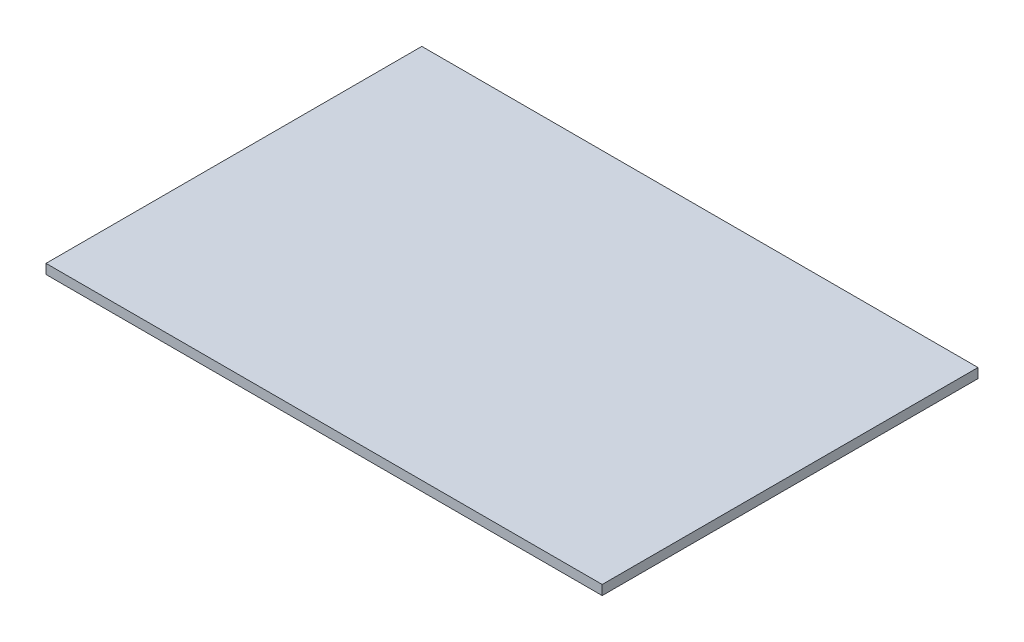
ISO-10303-21;
HEADER;
FILE_DESCRIPTION(('STEP AP214'),'2;1');
FILE_NAME('part.step','',(''),(''),'','','');
FILE_SCHEMA(('AUTOMOTIVE_DESIGN { 1 0 10303 214 1 1 1 1 }'));
ENDSEC;
DATA;
#1=APPLICATION_CONTEXT('core data for automotive mechanical design processes');
#2=APPLICATION_PROTOCOL_DEFINITION('international standard','automotive_design',2000,#1);
#3=PRODUCT_CONTEXT('',#1,'mechanical');
#4=PRODUCT('Part','Part','',(#3));
#5=PRODUCT_RELATED_PRODUCT_CATEGORY('part','',(#4));
#6=PRODUCT_DEFINITION_FORMATION('','',#4);
#7=PRODUCT_DEFINITION_CONTEXT('part definition',#1,'design');
#8=PRODUCT_DEFINITION('design','',#6,#7);
#9=PRODUCT_DEFINITION_SHAPE('','',#8);
#10=(LENGTH_UNIT() NAMED_UNIT(*) SI_UNIT(.MILLI.,.METRE.));
#11=(NAMED_UNIT(*) PLANE_ANGLE_UNIT() SI_UNIT($,.RADIAN.));
#12=(NAMED_UNIT(*) SI_UNIT($,.STERADIAN.) SOLID_ANGLE_UNIT());
#13=UNCERTAINTY_MEASURE_WITH_UNIT(LENGTH_MEASURE(1.E-05),#10,'distance_accuracy_value','');
#14=(GEOMETRIC_REPRESENTATION_CONTEXT(3) GLOBAL_UNCERTAINTY_ASSIGNED_CONTEXT((#13)) GLOBAL_UNIT_ASSIGNED_CONTEXT((#10,
#11,#12)) REPRESENTATION_CONTEXT('',''));
#15=CARTESIAN_POINT('',(0.,0.,0.));
#16=DIRECTION('',(0.,0.,1.));
#17=DIRECTION('',(1.,0.,0.));
#18=AXIS2_PLACEMENT_3D('',#15,#16,#17);
#19=CARTESIAN_POINT('',(518.,18.,-350.));
#20=DIRECTION('',(-1.,0.,0.));
#21=DIRECTION('',(0.,0.,1.));
#22=AXIS2_PLACEMENT_3D('',#19,#20,#21);
#23=PLANE('',#22);
#24=DIRECTION('',(0.,0.,-1.));
#25=VECTOR('',#24,1.);
#26=CARTESIAN_POINT('',(518.,0.,-350.));
#27=LINE('',#26,#25);
#28=CARTESIAN_POINT('',(518.,0.,350.));
#29=VERTEX_POINT('',#28);
#30=CARTESIAN_POINT('',(518.,0.,-350.));
#31=VERTEX_POINT('',#30);
#32=EDGE_CURVE('E96',#29,#31,#27,.T.);
#33=ORIENTED_EDGE('',*,*,#32,.T.);
#34=DIRECTION('',(0.,-1.,0.));
#35=VECTOR('',#34,1.);
#36=CARTESIAN_POINT('',(518.,18.,-350.));
#37=LINE('',#36,#35);
#38=CARTESIAN_POINT('',(518.,18.,-350.));
#39=VERTEX_POINT('',#38);
#40=EDGE_CURVE('E11',#39,#31,#37,.T.);
#41=ORIENTED_EDGE('',*,*,#40,.F.);
#42=DIRECTION('',(0.,0.,-1.));
#43=VECTOR('',#42,1.);
#44=CARTESIAN_POINT('',(518.,18.,-350.));
#45=LINE('',#44,#43);
#46=CARTESIAN_POINT('',(518.,18.,350.));
#47=VERTEX_POINT('',#46);
#48=EDGE_CURVE('E84',#47,#39,#45,.T.);
#49=ORIENTED_EDGE('',*,*,#48,.F.);
#50=DIRECTION('',(0.,-1.,0.));
#51=VECTOR('',#50,1.);
#52=CARTESIAN_POINT('',(518.,18.,350.));
#53=LINE('',#52,#51);
#54=EDGE_CURVE('E92',#47,#29,#53,.T.);
#55=ORIENTED_EDGE('',*,*,#54,.T.);
#56=EDGE_LOOP('',(#33,#41,#49,#55));
#57=FACE_BOUND('',#56,.T.);
#58=ADVANCED_FACE('F33',(#57),#23,.F.);
#59=CARTESIAN_POINT('',(-518.,18.,-350.));
#60=DIRECTION('',(0.,0.,1.));
#61=DIRECTION('',(1.,0.,0.));
#62=AXIS2_PLACEMENT_3D('',#59,#60,#61);
#63=PLANE('',#62);
#64=DIRECTION('',(-1.,0.,0.));
#65=VECTOR('',#64,1.);
#66=CARTESIAN_POINT('',(-518.,0.,-350.));
#67=LINE('',#66,#65);
#68=CARTESIAN_POINT('',(-518.,0.,-350.));
#69=VERTEX_POINT('',#68);
#70=EDGE_CURVE('E88',#31,#69,#67,.T.);
#71=ORIENTED_EDGE('',*,*,#70,.T.);
#72=DIRECTION('',(0.,-1.,0.));
#73=VECTOR('',#72,1.);
#74=CARTESIAN_POINT('',(-518.,18.,-350.));
#75=LINE('',#74,#73);
#76=CARTESIAN_POINT('',(-518.,18.,-350.));
#77=VERTEX_POINT('',#76);
#78=EDGE_CURVE('E41',#77,#69,#75,.T.);
#79=ORIENTED_EDGE('',*,*,#78,.F.);
#80=DIRECTION('',(-1.,0.,0.));
#81=VECTOR('',#80,1.);
#82=CARTESIAN_POINT('',(-518.,18.,-350.));
#83=LINE('',#82,#81);
#84=EDGE_CURVE('E79',#39,#77,#83,.T.);
#85=ORIENTED_EDGE('',*,*,#84,.F.);
#86=ORIENTED_EDGE('',*,*,#40,.T.);
#87=EDGE_LOOP('',(#71,#79,#85,#86));
#88=FACE_BOUND('',#87,.T.);
#89=ADVANCED_FACE('F87',(#88),#63,.F.);
#90=CARTESIAN_POINT('',(-518.,18.,-350.));
#91=DIRECTION('',(1.,0.,0.));
#92=DIRECTION('',(0.,0.,-1.));
#93=AXIS2_PLACEMENT_3D('',#90,#91,#92);
#94=PLANE('',#93);
#95=DIRECTION('',(0.,0.,1.));
#96=VECTOR('',#95,1.);
#97=CARTESIAN_POINT('',(-518.,0.,-350.));
#98=LINE('',#97,#96);
#99=CARTESIAN_POINT('',(-518.,0.,350.));
#100=VERTEX_POINT('',#99);
#101=EDGE_CURVE('E66',#69,#100,#98,.T.);
#102=ORIENTED_EDGE('',*,*,#101,.T.);
#103=DIRECTION('',(0.,-1.,0.));
#104=VECTOR('',#103,1.);
#105=CARTESIAN_POINT('',(-518.,18.,350.));
#106=LINE('',#105,#104);
#107=CARTESIAN_POINT('',(-518.,18.,350.));
#108=VERTEX_POINT('',#107);
#109=EDGE_CURVE('E89',#108,#100,#106,.T.);
#110=ORIENTED_EDGE('',*,*,#109,.F.);
#111=DIRECTION('',(0.,0.,1.));
#112=VECTOR('',#111,1.);
#113=CARTESIAN_POINT('',(-518.,18.,-350.));
#114=LINE('',#113,#112);
#115=EDGE_CURVE('E82',#77,#108,#114,.T.);
#116=ORIENTED_EDGE('',*,*,#115,.F.);
#117=ORIENTED_EDGE('',*,*,#78,.T.);
#118=EDGE_LOOP('',(#102,#110,#116,#117));
#119=FACE_BOUND('',#118,.T.);
#120=ADVANCED_FACE('F90',(#119),#94,.F.);
#121=CARTESIAN_POINT('',(-518.,18.,350.));
#122=DIRECTION('',(0.,0.,-1.));
#123=DIRECTION('',(-1.,0.,0.));
#124=AXIS2_PLACEMENT_3D('',#121,#122,#123);
#125=PLANE('',#124);
#126=DIRECTION('',(1.,0.,0.));
#127=VECTOR('',#126,1.);
#128=CARTESIAN_POINT('',(-518.,0.,350.));
#129=LINE('',#128,#127);
#130=EDGE_CURVE('E72',#100,#29,#129,.T.);
#131=ORIENTED_EDGE('',*,*,#130,.T.);
#132=ORIENTED_EDGE('',*,*,#54,.F.);
#133=DIRECTION('',(1.,0.,0.));
#134=VECTOR('',#133,1.);
#135=CARTESIAN_POINT('',(-518.,18.,350.));
#136=LINE('',#135,#134);
#137=EDGE_CURVE('E49',#108,#47,#136,.T.);
#138=ORIENTED_EDGE('',*,*,#137,.F.);
#139=ORIENTED_EDGE('',*,*,#109,.T.);
#140=EDGE_LOOP('',(#131,#132,#138,#139));
#141=FACE_BOUND('',#140,.T.);
#142=ADVANCED_FACE('F103',(#141),#125,.F.);
#143=CARTESIAN_POINT('',(0.,18.,0.));
#144=DIRECTION('',(0.,1.,0.));
#145=DIRECTION('',(0.,0.,1.));
#146=AXIS2_PLACEMENT_3D('',#143,#144,#145);
#147=PLANE('',#146);
#148=ORIENTED_EDGE('',*,*,#48,.T.);
#149=ORIENTED_EDGE('',*,*,#84,.T.);
#150=ORIENTED_EDGE('',*,*,#115,.T.);
#151=ORIENTED_EDGE('',*,*,#137,.T.);
#152=EDGE_LOOP('',(#148,#149,#150,#151));
#153=FACE_BOUND('',#152,.T.);
#154=ADVANCED_FACE('F80',(#153),#147,.T.);
#155=CARTESIAN_POINT('',(0.,0.,0.));
#156=DIRECTION('',(0.,1.,0.));
#157=DIRECTION('',(0.,0.,1.));
#158=AXIS2_PLACEMENT_3D('',#155,#156,#157);
#159=PLANE('',#158);
#160=ORIENTED_EDGE('',*,*,#32,.F.);
#161=ORIENTED_EDGE('',*,*,#130,.F.);
#162=ORIENTED_EDGE('',*,*,#101,.F.);
#163=ORIENTED_EDGE('',*,*,#70,.F.);
#164=EDGE_LOOP('',(#160,#161,#162,#163));
#165=FACE_BOUND('',#164,.T.);
#166=ADVANCED_FACE('F106',(#165),#159,.F.);
#167=CLOSED_SHELL('',(#58,#89,#120,#142,#154,#166));
#168=MANIFOLD_SOLID_BREP('B2',#167);
#169=ADVANCED_BREP_SHAPE_REPRESENTATION('',(#18,#168),#14);
#170=SHAPE_DEFINITION_REPRESENTATION(#9,#169);
ENDSEC;
END-ISO-10303-21;
